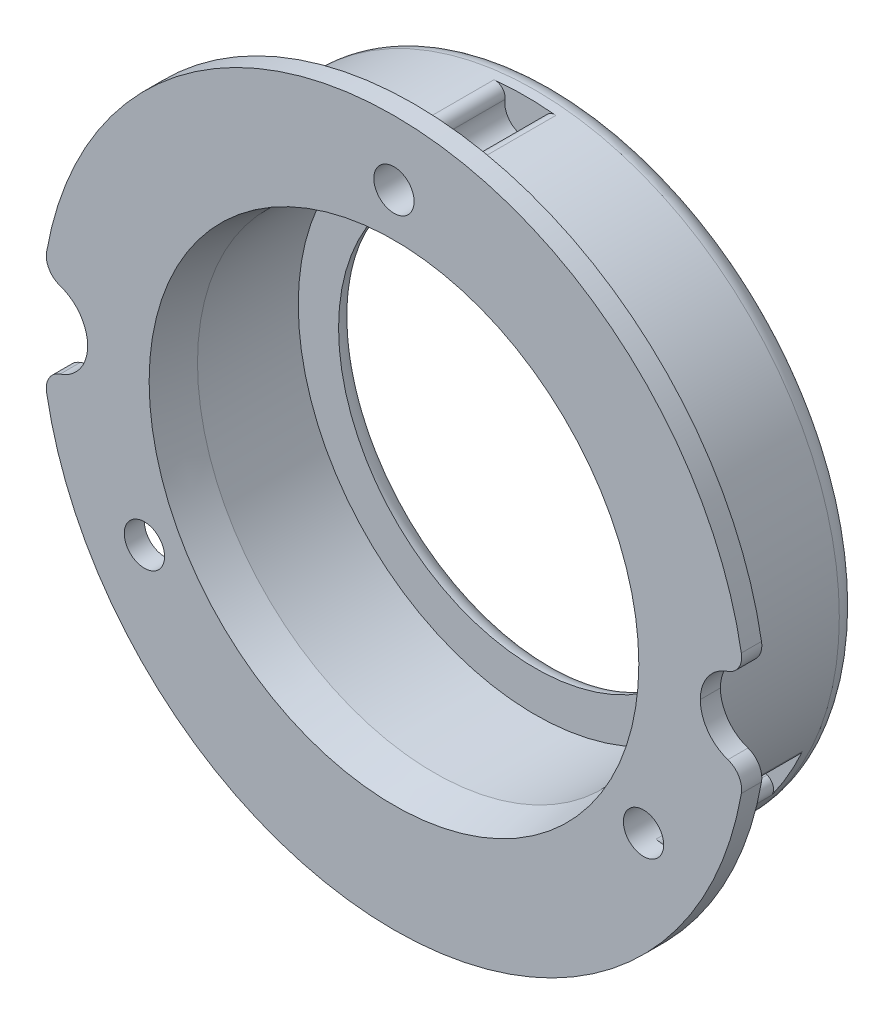
ISO-10303-21;
HEADER;
FILE_DESCRIPTION(('STEP AP214'),'2;1');
FILE_NAME('part.step','',(''),(''),'','','');
FILE_SCHEMA(('AUTOMOTIVE_DESIGN { 1 0 10303 214 1 1 1 1 }'));
ENDSEC;
DATA;
#1=APPLICATION_CONTEXT('core data for automotive mechanical design processes');
#2=APPLICATION_PROTOCOL_DEFINITION('international standard','automotive_design',2000,#1);
#3=PRODUCT_CONTEXT('',#1,'mechanical');
#4=PRODUCT('Part','Part','',(#3));
#5=PRODUCT_RELATED_PRODUCT_CATEGORY('part','',(#4));
#6=PRODUCT_DEFINITION_FORMATION('','',#4);
#7=PRODUCT_DEFINITION_CONTEXT('part definition',#1,'design');
#8=PRODUCT_DEFINITION('design','',#6,#7);
#9=PRODUCT_DEFINITION_SHAPE('','',#8);
#10=(LENGTH_UNIT() NAMED_UNIT(*) SI_UNIT(.MILLI.,.METRE.));
#11=(NAMED_UNIT(*) PLANE_ANGLE_UNIT() SI_UNIT($,.RADIAN.));
#12=(NAMED_UNIT(*) SI_UNIT($,.STERADIAN.) SOLID_ANGLE_UNIT());
#13=UNCERTAINTY_MEASURE_WITH_UNIT(LENGTH_MEASURE(1.E-05),#10,'distance_accuracy_value','');
#14=(GEOMETRIC_REPRESENTATION_CONTEXT(3) GLOBAL_UNCERTAINTY_ASSIGNED_CONTEXT((#13)) GLOBAL_UNIT_ASSIGNED_CONTEXT((#10,
#11,#12)) REPRESENTATION_CONTEXT('',''));
#15=CARTESIAN_POINT('',(0.,0.,0.));
#16=DIRECTION('',(0.,0.,1.));
#17=DIRECTION('',(1.,0.,0.));
#18=AXIS2_PLACEMENT_3D('',#15,#16,#17);
#19=CARTESIAN_POINT('',(0.,0.,4.5));
#20=DIRECTION('',(0.,0.,1.));
#21=DIRECTION('',(1.,0.,0.));
#22=AXIS2_PLACEMENT_3D('',#19,#20,#21);
#23=PLANE('',#22);
#24=CARTESIAN_POINT('',(0.,0.,4.5));
#25=DIRECTION('',(0.,0.,1.));
#26=DIRECTION('',(1.,0.,0.));
#27=AXIS2_PLACEMENT_3D('',#24,#25,#26);
#28=CIRCLE('',#27,12.15);
#29=CARTESIAN_POINT('',(12.15,0.,4.5));
#30=VERTEX_POINT('',#29);
#31=EDGE_CURVE('E11',#30,#30,#28,.F.);
#32=ORIENTED_EDGE('',*,*,#31,.T.);
#33=EDGE_LOOP('',(#32));
#34=FACE_BOUND('',#33,.T.);
#35=CARTESIAN_POINT('',(-12.3841632741175,-7.14999999999988,4.5));
#36=DIRECTION('',(0.,0.,1.));
#37=DIRECTION('',(-0.499999999999992,0.866025403784443,0.));
#38=AXIS2_PLACEMENT_3D('',#35,#36,#37);
#39=CIRCLE('',#38,1.);
#40=CARTESIAN_POINT('',(-12.8841632741175,-6.28397459621544,4.5));
#41=VERTEX_POINT('',#40);
#42=EDGE_CURVE('E473',#41,#41,#39,.T.);
#43=ORIENTED_EDGE('',*,*,#42,.F.);
#44=EDGE_LOOP('',(#43));
#45=FACE_BOUND('',#44,.T.);
#46=CARTESIAN_POINT('',(12.3841632741174,-7.15000000000006,4.5));
#47=DIRECTION('',(0.,0.,1.));
#48=DIRECTION('',(-0.500000000000004,-0.866025403784436,0.));
#49=AXIS2_PLACEMENT_3D('',#46,#47,#48);
#50=CIRCLE('',#49,1.);
#51=CARTESIAN_POINT('',(11.8841632741174,-8.0160254037845,4.5));
#52=VERTEX_POINT('',#51);
#53=EDGE_CURVE('E465',#52,#52,#50,.T.);
#54=ORIENTED_EDGE('',*,*,#53,.F.);
#55=EDGE_LOOP('',(#54));
#56=FACE_BOUND('',#55,.T.);
#57=CARTESIAN_POINT('',(0.,14.3,4.5));
#58=DIRECTION('',(0.,0.,1.));
#59=DIRECTION('',(1.,0.,0.));
#60=AXIS2_PLACEMENT_3D('',#57,#58,#59);
#61=CIRCLE('',#60,1.);
#62=CARTESIAN_POINT('',(1.,14.3,4.5));
#63=VERTEX_POINT('',#62);
#64=EDGE_CURVE('E457',#63,#63,#61,.T.);
#65=ORIENTED_EDGE('',*,*,#64,.F.);
#66=EDGE_LOOP('',(#65));
#67=FACE_BOUND('',#66,.T.);
#68=CARTESIAN_POINT('',(17.2,0.,4.5));
#69=DIRECTION('',(0.,0.,1.));
#70=DIRECTION('',(1.,0.,0.));
#71=AXIS2_PLACEMENT_3D('',#68,#69,#70);
#72=CIRCLE('',#71,2.);
#73=CARTESIAN_POINT('',(15.2,0.,4.5));
#74=VERTEX_POINT('',#73);
#75=CARTESIAN_POINT('',(16.5684108527132,1.89765517126519,4.5));
#76=VERTEX_POINT('',#75);
#77=EDGE_CURVE('E220',#74,#76,#72,.F.);
#78=ORIENTED_EDGE('',*,*,#77,.T.);
#79=CARTESIAN_POINT('',(16.2526162790698,2.84648275689778,4.5));
#80=DIRECTION('',(0.,0.,1.));
#81=DIRECTION('',(1.,0.,0.));
#82=AXIS2_PLACEMENT_3D('',#79,#80,#81);
#83=CIRCLE('',#82,1.);
#84=CARTESIAN_POINT('',(17.2376233262861,3.01899686337644,4.5));
#85=VERTEX_POINT('',#84);
#86=EDGE_CURVE('E243',#76,#85,#83,.T.);
#87=ORIENTED_EDGE('',*,*,#86,.T.);
#88=CARTESIAN_POINT('',(0.,0.,4.5));
#89=DIRECTION('',(0.,0.,1.));
#90=DIRECTION('',(1.,0.,0.));
#91=AXIS2_PLACEMENT_3D('',#88,#89,#90);
#92=CIRCLE('',#91,17.5);
#93=CARTESIAN_POINT('',(-17.2376233262861,3.01899686337643,4.5));
#94=VERTEX_POINT('',#93);
#95=EDGE_CURVE('E449',#85,#94,#92,.T.);
#96=ORIENTED_EDGE('',*,*,#95,.T.);
#97=CARTESIAN_POINT('',(-16.2526162790698,2.84648275689778,4.5));
#98=DIRECTION('',(0.,0.,1.));
#99=DIRECTION('',(1.,0.,0.));
#100=AXIS2_PLACEMENT_3D('',#97,#98,#99);
#101=CIRCLE('',#100,1.);
#102=CARTESIAN_POINT('',(-16.5684108527132,1.89765517126519,4.5));
#103=VERTEX_POINT('',#102);
#104=EDGE_CURVE('E237',#94,#103,#101,.T.);
#105=ORIENTED_EDGE('',*,*,#104,.T.);
#106=CARTESIAN_POINT('',(-17.2,0.,4.5));
#107=DIRECTION('',(0.,0.,1.));
#108=DIRECTION('',(1.,0.,0.));
#109=AXIS2_PLACEMENT_3D('',#106,#107,#108);
#110=CIRCLE('',#109,2.);
#111=CARTESIAN_POINT('',(-15.2,0.,4.5));
#112=VERTEX_POINT('',#111);
#113=EDGE_CURVE('E207',#103,#112,#110,.F.);
#114=ORIENTED_EDGE('',*,*,#113,.T.);
#115=CARTESIAN_POINT('',(-17.2,0.,4.5));
#116=DIRECTION('',(0.,0.,1.));
#117=DIRECTION('',(1.,0.,0.));
#118=AXIS2_PLACEMENT_3D('',#115,#116,#117);
#119=CIRCLE('',#118,2.);
#120=CARTESIAN_POINT('',(-16.5684108527132,-1.89765517126519,4.5));
#121=VERTEX_POINT('',#120);
#122=EDGE_CURVE('E195',#112,#121,#119,.F.);
#123=ORIENTED_EDGE('',*,*,#122,.T.);
#124=CARTESIAN_POINT('',(-16.2526162790698,-2.84648275689778,4.5));
#125=DIRECTION('',(0.,0.,1.));
#126=DIRECTION('',(1.,0.,0.));
#127=AXIS2_PLACEMENT_3D('',#124,#125,#126);
#128=CIRCLE('',#127,1.);
#129=CARTESIAN_POINT('',(-17.2376233262861,-3.01899686337643,4.5));
#130=VERTEX_POINT('',#129);
#131=EDGE_CURVE('E239',#121,#130,#128,.T.);
#132=ORIENTED_EDGE('',*,*,#131,.T.);
#133=CARTESIAN_POINT('',(17.2376233262861,-3.01899686337644,4.5));
#134=VERTEX_POINT('',#133);
#135=EDGE_CURVE('E452',#130,#134,#92,.T.);
#136=ORIENTED_EDGE('',*,*,#135,.T.);
#137=CARTESIAN_POINT('',(16.2526162790698,-2.84648275689778,4.5));
#138=DIRECTION('',(0.,0.,1.));
#139=DIRECTION('',(1.,0.,0.));
#140=AXIS2_PLACEMENT_3D('',#137,#138,#139);
#141=CIRCLE('',#140,1.);
#142=CARTESIAN_POINT('',(16.5684108527132,-1.89765517126519,4.5));
#143=VERTEX_POINT('',#142);
#144=EDGE_CURVE('E241',#134,#143,#141,.T.);
#145=ORIENTED_EDGE('',*,*,#144,.T.);
#146=CARTESIAN_POINT('',(17.2,0.,4.5));
#147=DIRECTION('',(0.,0.,1.));
#148=DIRECTION('',(1.,0.,0.));
#149=AXIS2_PLACEMENT_3D('',#146,#147,#148);
#150=CIRCLE('',#149,2.);
#151=EDGE_CURVE('E708',#143,#74,#150,.F.);
#152=ORIENTED_EDGE('',*,*,#151,.T.);
#153=EDGE_LOOP('',(#78,#87,#96,#105,#114,#123,#132,#136,#145,#152));
#154=FACE_BOUND('',#153,.T.);
#155=ADVANCED_FACE('F37',(#34,#45,#56,#67,#154),#23,.T.);
#156=CARTESIAN_POINT('',(0.,0.,3.5));
#157=DIRECTION('',(0.,0.,1.));
#158=DIRECTION('',(1.,0.,0.));
#159=AXIS2_PLACEMENT_3D('',#156,#157,#158);
#160=PLANE('',#159);
#161=CARTESIAN_POINT('',(0.,14.3,3.5));
#162=DIRECTION('',(0.,0.,1.));
#163=DIRECTION('',(1.,0.,0.));
#164=AXIS2_PLACEMENT_3D('',#161,#162,#163);
#165=CIRCLE('',#164,1.);
#166=CARTESIAN_POINT('',(0.988738981152018,14.4496503496503,3.5));
#167=VERTEX_POINT('',#166);
#168=CARTESIAN_POINT('',(-0.988738981152017,14.4496503496503,3.5));
#169=VERTEX_POINT('',#168);
#170=EDGE_CURVE('E52',#167,#169,#165,.T.);
#171=ORIENTED_EDGE('',*,*,#170,.T.);
#172=CARTESIAN_POINT('',(-1.48310847172803,14.5244755244755,3.5));
#173=DIRECTION('',(0.,0.,1.));
#174=DIRECTION('',(1.,0.,0.));
#175=AXIS2_PLACEMENT_3D('',#172,#173,#174);
#176=CIRCLE('',#175,0.5);
#177=CARTESIAN_POINT('',(-1.53389985774611,15.0218890698343,3.5));
#178=VERTEX_POINT('',#177);
#179=EDGE_CURVE('E315',#169,#178,#176,.T.);
#180=ORIENTED_EDGE('',*,*,#179,.T.);
#181=CARTESIAN_POINT('',(0.,0.,3.5));
#182=DIRECTION('',(0.,0.,1.));
#183=DIRECTION('',(1.,0.,0.));
#184=AXIS2_PLACEMENT_3D('',#181,#182,#183);
#185=CIRCLE('',#184,15.1);
#186=CARTESIAN_POINT('',(-13.7762874761814,-6.18254829124754,3.5));
#187=VERTEX_POINT('',#186);
#188=EDGE_CURVE('E430',#178,#187,#185,.T.);
#189=ORIENTED_EDGE('',*,*,#188,.T.);
#190=CARTESIAN_POINT('',(-13.3201190167052,-5.97782814915325,3.5));
#191=DIRECTION('',(0.,0.,1.));
#192=DIRECTION('',(1.,0.,0.));
#193=AXIS2_PLACEMENT_3D('',#190,#191,#192);
#194=CIRCLE('',#193,0.5);
#195=CARTESIAN_POINT('',(-13.008133769176,-6.36855209943546,3.5));
#196=VERTEX_POINT('',#195);
#197=EDGE_CURVE('E307',#187,#196,#194,.T.);
#198=ORIENTED_EDGE('',*,*,#197,.T.);
#199=CARTESIAN_POINT('',(-12.3841632741175,-7.14999999999988,3.5));
#200=DIRECTION('',(0.,0.,1.));
#201=DIRECTION('',(1.,0.,0.));
#202=AXIS2_PLACEMENT_3D('',#199,#200,#201);
#203=CIRCLE('',#202,1.);
#204=CARTESIAN_POINT('',(-12.019394788024,-8.08109825021465,3.5));
#205=VERTEX_POINT('',#204);
#206=EDGE_CURVE('E468',#196,#205,#203,.T.);
#207=ORIENTED_EDGE('',*,*,#206,.T.);
#208=CARTESIAN_POINT('',(-11.8370105449772,-8.54664737532203,3.5));
#209=DIRECTION('',(0.,0.,1.));
#210=DIRECTION('',(1.,0.,0.));
#211=AXIS2_PLACEMENT_3D('',#208,#209,#210);
#212=CIRCLE('',#211,0.5);
#213=CARTESIAN_POINT('',(-12.2423876184353,-8.83934077858649,3.5));
#214=VERTEX_POINT('',#213);
#215=EDGE_CURVE('E305',#205,#214,#212,.T.);
#216=ORIENTED_EDGE('',*,*,#215,.T.);
#217=CARTESIAN_POINT('',(12.2423876184352,-8.83934077858666,3.5));
#218=VERTEX_POINT('',#217);
#219=EDGE_CURVE('E434',#214,#218,#185,.T.);
#220=ORIENTED_EDGE('',*,*,#219,.T.);
#221=CARTESIAN_POINT('',(11.8370105449771,-8.5466473753222,3.5));
#222=DIRECTION('',(0.,0.,1.));
#223=DIRECTION('',(1.,0.,0.));
#224=AXIS2_PLACEMENT_3D('',#221,#222,#223);
#225=CIRCLE('',#224,0.5);
#226=CARTESIAN_POINT('',(12.0193947880239,-8.08109825021482,3.5));
#227=VERTEX_POINT('',#226);
#228=EDGE_CURVE('E293',#218,#227,#225,.T.);
#229=ORIENTED_EDGE('',*,*,#228,.T.);
#230=CARTESIAN_POINT('',(12.3841632741174,-7.15000000000006,3.5));
#231=DIRECTION('',(0.,0.,1.));
#232=DIRECTION('',(1.,0.,0.));
#233=AXIS2_PLACEMENT_3D('',#230,#231,#232);
#234=CIRCLE('',#233,1.);
#235=CARTESIAN_POINT('',(13.0081337691759,-6.36855209943564,3.5));
#236=VERTEX_POINT('',#235);
#237=EDGE_CURVE('E460',#227,#236,#234,.T.);
#238=ORIENTED_EDGE('',*,*,#237,.T.);
#239=CARTESIAN_POINT('',(13.3201190167051,-5.97782814915344,3.5));
#240=DIRECTION('',(0.,0.,1.));
#241=DIRECTION('',(1.,0.,0.));
#242=AXIS2_PLACEMENT_3D('',#239,#240,#241);
#243=CIRCLE('',#242,0.5);
#244=CARTESIAN_POINT('',(13.7762874761813,-6.18254829124773,3.5));
#245=VERTEX_POINT('',#244);
#246=EDGE_CURVE('E301',#236,#245,#243,.T.);
#247=ORIENTED_EDGE('',*,*,#246,.T.);
#248=CARTESIAN_POINT('',(1.53389985774611,15.0218890698343,3.5));
#249=VERTEX_POINT('',#248);
#250=EDGE_CURVE('E436',#245,#249,#185,.T.);
#251=ORIENTED_EDGE('',*,*,#250,.T.);
#252=CARTESIAN_POINT('',(1.48310847172803,14.5244755244755,3.5));
#253=DIRECTION('',(0.,0.,1.));
#254=DIRECTION('',(1.,0.,0.));
#255=AXIS2_PLACEMENT_3D('',#252,#253,#254);
#256=CIRCLE('',#255,0.5);
#257=EDGE_CURVE('E317',#249,#167,#256,.T.);
#258=ORIENTED_EDGE('',*,*,#257,.T.);
#259=EDGE_LOOP('',(#171,#180,#189,#198,#207,#216,#220,#229,#238,#247,#251,#258));
#260=FACE_BOUND('',#259,.T.);
#261=CARTESIAN_POINT('',(0.,0.,3.5));
#262=DIRECTION('',(0.,0.,1.));
#263=DIRECTION('',(1.,0.,0.));
#264=AXIS2_PLACEMENT_3D('',#261,#262,#263);
#265=CIRCLE('',#264,17.5);
#266=CARTESIAN_POINT('',(17.2376233262861,3.01899686337644,3.5));
#267=VERTEX_POINT('',#266);
#268=CARTESIAN_POINT('',(-17.2376233262861,3.01899686337643,3.5));
#269=VERTEX_POINT('',#268);
#270=EDGE_CURVE('E215',#267,#269,#265,.T.);
#271=ORIENTED_EDGE('',*,*,#270,.F.);
#272=CARTESIAN_POINT('',(16.2526162790698,2.84648275689778,3.5));
#273=DIRECTION('',(0.,0.,1.));
#274=DIRECTION('',(1.,0.,0.));
#275=AXIS2_PLACEMENT_3D('',#272,#273,#274);
#276=CIRCLE('',#275,1.);
#277=CARTESIAN_POINT('',(16.5684108527132,1.89765517126519,3.5));
#278=VERTEX_POINT('',#277);
#279=EDGE_CURVE('E233',#267,#278,#276,.F.);
#280=ORIENTED_EDGE('',*,*,#279,.T.);
#281=CARTESIAN_POINT('',(17.2,0.,3.5));
#282=DIRECTION('',(0.,0.,1.));
#283=DIRECTION('',(1.,0.,0.));
#284=AXIS2_PLACEMENT_3D('',#281,#282,#283);
#285=CIRCLE('',#284,2.);
#286=CARTESIAN_POINT('',(15.2,0.,3.5));
#287=VERTEX_POINT('',#286);
#288=EDGE_CURVE('E703',#278,#287,#285,.T.);
#289=ORIENTED_EDGE('',*,*,#288,.T.);
#290=CARTESIAN_POINT('',(17.2,0.,3.5));
#291=DIRECTION('',(0.,0.,1.));
#292=DIRECTION('',(1.,0.,0.));
#293=AXIS2_PLACEMENT_3D('',#290,#291,#292);
#294=CIRCLE('',#293,2.);
#295=CARTESIAN_POINT('',(16.5684108527132,-1.89765517126519,3.5));
#296=VERTEX_POINT('',#295);
#297=EDGE_CURVE('E709',#287,#296,#294,.T.);
#298=ORIENTED_EDGE('',*,*,#297,.T.);
#299=CARTESIAN_POINT('',(16.2526162790698,-2.84648275689778,3.5));
#300=DIRECTION('',(0.,0.,1.));
#301=DIRECTION('',(1.,0.,0.));
#302=AXIS2_PLACEMENT_3D('',#299,#300,#301);
#303=CIRCLE('',#302,1.);
#304=CARTESIAN_POINT('',(17.2376233262861,-3.01899686337644,3.5));
#305=VERTEX_POINT('',#304);
#306=EDGE_CURVE('E231',#296,#305,#303,.F.);
#307=ORIENTED_EDGE('',*,*,#306,.T.);
#308=CARTESIAN_POINT('',(-17.2376233262861,-3.01899686337643,3.5));
#309=VERTEX_POINT('',#308);
#310=EDGE_CURVE('E211',#309,#305,#265,.T.);
#311=ORIENTED_EDGE('',*,*,#310,.F.);
#312=CARTESIAN_POINT('',(-16.2526162790698,-2.84648275689778,3.5));
#313=DIRECTION('',(0.,0.,1.));
#314=DIRECTION('',(1.,0.,0.));
#315=AXIS2_PLACEMENT_3D('',#312,#313,#314);
#316=CIRCLE('',#315,1.);
#317=CARTESIAN_POINT('',(-16.5684108527132,-1.89765517126519,3.5));
#318=VERTEX_POINT('',#317);
#319=EDGE_CURVE('E190',#309,#318,#316,.F.);
#320=ORIENTED_EDGE('',*,*,#319,.T.);
#321=CARTESIAN_POINT('',(-17.2,0.,3.5));
#322=DIRECTION('',(0.,0.,1.));
#323=DIRECTION('',(1.,0.,0.));
#324=AXIS2_PLACEMENT_3D('',#321,#322,#323);
#325=CIRCLE('',#324,2.);
#326=CARTESIAN_POINT('',(-15.2,0.,3.5));
#327=VERTEX_POINT('',#326);
#328=EDGE_CURVE('E183',#318,#327,#325,.T.);
#329=ORIENTED_EDGE('',*,*,#328,.T.);
#330=CARTESIAN_POINT('',(-17.2,0.,3.5));
#331=DIRECTION('',(0.,0.,1.));
#332=DIRECTION('',(1.,0.,0.));
#333=AXIS2_PLACEMENT_3D('',#330,#331,#332);
#334=CIRCLE('',#333,2.);
#335=CARTESIAN_POINT('',(-16.5684108527132,1.89765517126519,3.5));
#336=VERTEX_POINT('',#335);
#337=EDGE_CURVE('E187',#327,#336,#334,.T.);
#338=ORIENTED_EDGE('',*,*,#337,.T.);
#339=CARTESIAN_POINT('',(-16.2526162790698,2.84648275689778,3.5));
#340=DIRECTION('',(0.,0.,1.));
#341=DIRECTION('',(1.,0.,0.));
#342=AXIS2_PLACEMENT_3D('',#339,#340,#341);
#343=CIRCLE('',#342,1.);
#344=EDGE_CURVE('E228',#336,#269,#343,.F.);
#345=ORIENTED_EDGE('',*,*,#344,.T.);
#346=EDGE_LOOP('',(#271,#280,#289,#298,#307,#311,#320,#329,#338,#345));
#347=FACE_BOUND('',#346,.T.);
#348=ADVANCED_FACE('F186',(#260,#347),#160,.F.);
#349=CARTESIAN_POINT('',(0.,0.,4.5));
#350=DIRECTION('',(0.,0.,-1.));
#351=DIRECTION('',(-1.,0.,0.));
#352=AXIS2_PLACEMENT_3D('',#349,#350,#351);
#353=CYLINDRICAL_SURFACE('',#352,17.5);
#354=ORIENTED_EDGE('',*,*,#310,.T.);
#355=DIRECTION('',(0.,0.,-1.));
#356=VECTOR('',#355,1.);
#357=CARTESIAN_POINT('',(17.2376233262861,-3.01899686337644,4.5));
#358=LINE('',#357,#356);
#359=EDGE_CURVE('E247',#305,#134,#358,.F.);
#360=ORIENTED_EDGE('',*,*,#359,.T.);
#361=ORIENTED_EDGE('',*,*,#135,.F.);
#362=DIRECTION('',(0.,0.,-1.));
#363=VECTOR('',#362,1.);
#364=CARTESIAN_POINT('',(-17.2376233262861,-3.01899686337644,4.5));
#365=LINE('',#364,#363);
#366=EDGE_CURVE('E245',#130,#309,#365,.T.);
#367=ORIENTED_EDGE('',*,*,#366,.T.);
#368=EDGE_LOOP('',(#354,#360,#361,#367));
#369=FACE_BOUND('',#368,.T.);
#370=ADVANCED_FACE('F342',(#369),#353,.T.);
#371=ORIENTED_EDGE('',*,*,#95,.F.);
#372=DIRECTION('',(0.,0.,-1.));
#373=VECTOR('',#372,1.);
#374=CARTESIAN_POINT('',(17.2376233262861,3.01899686337644,4.5));
#375=LINE('',#374,#373);
#376=EDGE_CURVE('E225',#85,#267,#375,.T.);
#377=ORIENTED_EDGE('',*,*,#376,.T.);
#378=ORIENTED_EDGE('',*,*,#270,.T.);
#379=DIRECTION('',(0.,0.,-1.));
#380=VECTOR('',#379,1.);
#381=CARTESIAN_POINT('',(-17.2376233262861,3.01899686337644,4.5));
#382=LINE('',#381,#380);
#383=EDGE_CURVE('E223',#269,#94,#382,.F.);
#384=ORIENTED_EDGE('',*,*,#383,.T.);
#385=EDGE_LOOP('',(#371,#377,#378,#384));
#386=FACE_BOUND('',#385,.T.);
#387=ADVANCED_FACE('F351',(#386),#353,.T.);
#388=CARTESIAN_POINT('',(0.,0.,3.5));
#389=DIRECTION('',(0.,0.,-1.));
#390=DIRECTION('',(-1.,0.,0.));
#391=AXIS2_PLACEMENT_3D('',#388,#389,#390);
#392=CYLINDRICAL_SURFACE('',#391,11.75);
#393=CARTESIAN_POINT('',(0.,0.,2.50000000000001));
#394=DIRECTION('',(0.,0.,1.));
#395=DIRECTION('',(1.,0.,0.));
#396=AXIS2_PLACEMENT_3D('',#393,#394,#395);
#397=CIRCLE('',#396,11.75);
#398=CARTESIAN_POINT('',(11.75,0.,2.50000000000001));
#399=VERTEX_POINT('',#398);
#400=EDGE_CURVE('E45',#399,#399,#397,.T.);
#401=ORIENTED_EDGE('',*,*,#400,.T.);
#402=EDGE_LOOP('',(#401));
#403=FACE_BOUND('',#402,.T.);
#404=CARTESIAN_POINT('',(0.,0.,-2.5));
#405=DIRECTION('',(0.,0.,-1.));
#406=DIRECTION('',(-1.,0.,0.));
#407=AXIS2_PLACEMENT_3D('',#404,#405,#406);
#408=CIRCLE('',#407,11.75);
#409=CARTESIAN_POINT('',(-11.75,0.,-2.5));
#410=VERTEX_POINT('',#409);
#411=EDGE_CURVE('E443',#410,#410,#408,.T.);
#412=ORIENTED_EDGE('',*,*,#411,.T.);
#413=EDGE_LOOP('',(#412));
#414=FACE_BOUND('',#413,.T.);
#415=ADVANCED_FACE('F324',(#403,#414),#392,.F.);
#416=CARTESIAN_POINT('',(0.,0.,-3.5));
#417=DIRECTION('',(0.,0.,1.));
#418=DIRECTION('',(1.,0.,0.));
#419=AXIS2_PLACEMENT_3D('',#416,#417,#418);
#420=PLANE('',#419);
#421=CARTESIAN_POINT('',(0.,0.,-3.5));
#422=DIRECTION('',(0.,0.,1.));
#423=DIRECTION('',(1.,0.,0.));
#424=AXIS2_PLACEMENT_3D('',#421,#422,#423);
#425=CIRCLE('',#424,10.75);
#426=CARTESIAN_POINT('',(10.75,0.,-3.5));
#427=VERTEX_POINT('',#426);
#428=EDGE_CURVE('E196',#427,#427,#425,.T.);
#429=ORIENTED_EDGE('',*,*,#428,.T.);
#430=EDGE_LOOP('',(#429));
#431=FACE_BOUND('',#430,.T.);
#432=CARTESIAN_POINT('',(0.,0.,-3.5));
#433=DIRECTION('',(0.,0.,1.));
#434=DIRECTION('',(1.,0.,0.));
#435=AXIS2_PLACEMENT_3D('',#432,#433,#434);
#436=CIRCLE('',#435,14.1);
#437=CARTESIAN_POINT('',(14.1,0.,-3.5));
#438=VERTEX_POINT('',#437);
#439=EDGE_CURVE('E438',#438,#438,#436,.F.);
#440=ORIENTED_EDGE('',*,*,#439,.T.);
#441=EDGE_LOOP('',(#440));
#442=FACE_BOUND('',#441,.T.);
#443=ADVANCED_FACE('F361',(#431,#442),#420,.F.);
#444=CARTESIAN_POINT('',(0.,0.,3.5));
#445=DIRECTION('',(0.,0.,-1.));
#446=DIRECTION('',(-1.,0.,0.));
#447=AXIS2_PLACEMENT_3D('',#444,#445,#446);
#448=CYLINDRICAL_SURFACE('',#447,15.1);
#449=CARTESIAN_POINT('',(0.,0.,-2.5));
#450=DIRECTION('',(0.,0.,1.));
#451=DIRECTION('',(1.,0.,0.));
#452=AXIS2_PLACEMENT_3D('',#449,#450,#451);
#453=CIRCLE('',#452,15.1);
#454=CARTESIAN_POINT('',(15.1,0.,-2.5));
#455=VERTEX_POINT('',#454);
#456=EDGE_CURVE('E433',#455,#455,#453,.T.);
#457=ORIENTED_EDGE('',*,*,#456,.T.);
#458=EDGE_LOOP('',(#457));
#459=FACE_BOUND('',#458,.T.);
#460=CARTESIAN_POINT('',(0.,0.,-2.));
#461=DIRECTION('',(0.,0.,1.));
#462=DIRECTION('',(1.,0.,0.));
#463=AXIS2_PLACEMENT_3D('',#460,#461,#462);
#464=CIRCLE('',#463,15.1);
#465=CARTESIAN_POINT('',(12.2423876184352,-8.83934077858666,-2.));
#466=VERTEX_POINT('',#465);
#467=CARTESIAN_POINT('',(13.7762874761813,-6.18254829124773,-2.));
#468=VERTEX_POINT('',#467);
#469=EDGE_CURVE('E257',#466,#468,#464,.T.);
#470=ORIENTED_EDGE('',*,*,#469,.F.);
#471=DIRECTION('',(0.,0.,-1.));
#472=VECTOR('',#471,1.);
#473=CARTESIAN_POINT('',(12.2423876184352,-8.83934077858666,3.5));
#474=LINE('',#473,#472);
#475=EDGE_CURVE('E276',#466,#218,#474,.F.);
#476=ORIENTED_EDGE('',*,*,#475,.T.);
#477=ORIENTED_EDGE('',*,*,#219,.F.);
#478=DIRECTION('',(0.,0.,-1.));
#479=VECTOR('',#478,1.);
#480=CARTESIAN_POINT('',(-12.2423876184353,-8.83934077858649,3.5));
#481=LINE('',#480,#479);
#482=CARTESIAN_POINT('',(-12.2423876184353,-8.83934077858649,-2.));
#483=VERTEX_POINT('',#482);
#484=EDGE_CURVE('E270',#214,#483,#481,.T.);
#485=ORIENTED_EDGE('',*,*,#484,.T.);
#486=CARTESIAN_POINT('',(0.,0.,-2.));
#487=DIRECTION('',(0.,0.,1.));
#488=DIRECTION('',(1.,0.,0.));
#489=AXIS2_PLACEMENT_3D('',#486,#487,#488);
#490=CIRCLE('',#489,15.1);
#491=CARTESIAN_POINT('',(-13.7762874761814,-6.18254829124754,-2.));
#492=VERTEX_POINT('',#491);
#493=EDGE_CURVE('E259',#492,#483,#490,.T.);
#494=ORIENTED_EDGE('',*,*,#493,.F.);
#495=DIRECTION('',(0.,0.,-1.));
#496=VECTOR('',#495,1.);
#497=CARTESIAN_POINT('',(-13.7762874761814,-6.18254829124754,3.5));
#498=LINE('',#497,#496);
#499=EDGE_CURVE('E267',#492,#187,#498,.F.);
#500=ORIENTED_EDGE('',*,*,#499,.T.);
#501=ORIENTED_EDGE('',*,*,#188,.F.);
#502=DIRECTION('',(0.,0.,-1.));
#503=VECTOR('',#502,1.);
#504=CARTESIAN_POINT('',(-1.53389985774611,15.0218890698343,3.5));
#505=LINE('',#504,#503);
#506=CARTESIAN_POINT('',(-1.53389985774611,15.0218890698343,-2.));
#507=VERTEX_POINT('',#506);
#508=EDGE_CURVE('E264',#178,#507,#505,.T.);
#509=ORIENTED_EDGE('',*,*,#508,.T.);
#510=CARTESIAN_POINT('',(0.,0.,-2.));
#511=DIRECTION('',(0.,0.,1.));
#512=DIRECTION('',(1.,0.,0.));
#513=AXIS2_PLACEMENT_3D('',#510,#511,#512);
#514=CIRCLE('',#513,15.1);
#515=CARTESIAN_POINT('',(1.53389985774611,15.0218890698343,-2.));
#516=VERTEX_POINT('',#515);
#517=EDGE_CURVE('E255',#516,#507,#514,.T.);
#518=ORIENTED_EDGE('',*,*,#517,.F.);
#519=DIRECTION('',(0.,0.,-1.));
#520=VECTOR('',#519,1.);
#521=CARTESIAN_POINT('',(1.53389985774611,15.0218890698343,3.5));
#522=LINE('',#521,#520);
#523=EDGE_CURVE('E261',#516,#249,#522,.F.);
#524=ORIENTED_EDGE('',*,*,#523,.T.);
#525=ORIENTED_EDGE('',*,*,#250,.F.);
#526=DIRECTION('',(0.,0.,-1.));
#527=VECTOR('',#526,1.);
#528=CARTESIAN_POINT('',(13.7762874761813,-6.18254829124773,3.5));
#529=LINE('',#528,#527);
#530=EDGE_CURVE('E273',#245,#468,#529,.T.);
#531=ORIENTED_EDGE('',*,*,#530,.T.);
#532=EDGE_LOOP('',(#470,#476,#477,#485,#494,#500,#501,#509,#518,#524,#525,#531));
#533=FACE_BOUND('',#532,.T.);
#534=ADVANCED_FACE('F357',(#459,#533),#448,.T.);
#535=CARTESIAN_POINT('',(0.,0.,-2.5));
#536=DIRECTION('',(0.,0.,-1.));
#537=DIRECTION('',(-1.,0.,0.));
#538=AXIS2_PLACEMENT_3D('',#535,#536,#537);
#539=PLANE('',#538);
#540=CARTESIAN_POINT('',(0.,0.,-2.5));
#541=DIRECTION('',(0.,0.,-1.));
#542=DIRECTION('',(-1.,0.,0.));
#543=AXIS2_PLACEMENT_3D('',#540,#541,#542);
#544=CIRCLE('',#543,9.75);
#545=CARTESIAN_POINT('',(-9.75,0.,-2.5));
#546=VERTEX_POINT('',#545);
#547=EDGE_CURVE('E446',#546,#546,#544,.T.);
#548=ORIENTED_EDGE('',*,*,#547,.T.);
#549=EDGE_LOOP('',(#548));
#550=FACE_BOUND('',#549,.T.);
#551=ORIENTED_EDGE('',*,*,#411,.F.);
#552=EDGE_LOOP('',(#551));
#553=FACE_BOUND('',#552,.T.);
#554=ADVANCED_FACE('F353',(#550,#553),#539,.F.);
#555=CARTESIAN_POINT('',(0.,0.,-2.5));
#556=DIRECTION('',(0.,0.,1.));
#557=DIRECTION('',(1.,0.,0.));
#558=AXIS2_PLACEMENT_3D('',#555,#556,#557);
#559=TOROIDAL_SURFACE('',#558,14.1,1.);
#560=ORIENTED_EDGE('',*,*,#439,.F.);
#561=EDGE_LOOP('',(#560));
#562=FACE_BOUND('',#561,.T.);
#563=ORIENTED_EDGE('',*,*,#456,.F.);
#564=EDGE_LOOP('',(#563));
#565=FACE_BOUND('',#564,.T.);
#566=ADVANCED_FACE('F356',(#562,#565),#559,.T.);
#567=CARTESIAN_POINT('',(0.,0.,-2.5));
#568=DIRECTION('',(0.,0.,1.));
#569=DIRECTION('',(1.,0.,0.));
#570=AXIS2_PLACEMENT_3D('',#567,#568,#569);
#571=TOROIDAL_SURFACE('',#570,10.75,1.);
#572=ORIENTED_EDGE('',*,*,#428,.F.);
#573=EDGE_LOOP('',(#572));
#574=FACE_BOUND('',#573,.T.);
#575=ORIENTED_EDGE('',*,*,#547,.F.);
#576=EDGE_LOOP('',(#575));
#577=FACE_BOUND('',#576,.T.);
#578=ADVANCED_FACE('F370',(#574,#577),#571,.T.);
#579=CARTESIAN_POINT('',(-17.2,0.,4.5));
#580=DIRECTION('',(0.,0.,-1.));
#581=DIRECTION('',(-1.,0.,0.));
#582=AXIS2_PLACEMENT_3D('',#579,#580,#581);
#583=CYLINDRICAL_SURFACE('',#582,2.);
#584=ORIENTED_EDGE('',*,*,#113,.F.);
#585=DIRECTION('',(0.,0.,-1.));
#586=VECTOR('',#585,1.);
#587=CARTESIAN_POINT('',(-16.5684108527132,1.89765517126519,4.5));
#588=LINE('',#587,#586);
#589=EDGE_CURVE('E206',#103,#336,#588,.T.);
#590=ORIENTED_EDGE('',*,*,#589,.T.);
#591=ORIENTED_EDGE('',*,*,#337,.F.);
#592=DIRECTION('',(0.,0.,-1.));
#593=VECTOR('',#592,1.);
#594=CARTESIAN_POINT('',(-15.2,0.,4.5));
#595=LINE('',#594,#593);
#596=EDGE_CURVE('E203',#112,#327,#595,.T.);
#597=ORIENTED_EDGE('',*,*,#596,.F.);
#598=EDGE_LOOP('',(#584,#590,#591,#597));
#599=FACE_BOUND('',#598,.T.);
#600=ADVANCED_FACE('F202',(#599),#583,.F.);
#601=CARTESIAN_POINT('',(-17.2,0.,4.5));
#602=DIRECTION('',(0.,0.,-1.));
#603=DIRECTION('',(-1.,0.,0.));
#604=AXIS2_PLACEMENT_3D('',#601,#602,#603);
#605=CYLINDRICAL_SURFACE('',#604,2.);
#606=ORIENTED_EDGE('',*,*,#328,.F.);
#607=DIRECTION('',(0.,0.,-1.));
#608=VECTOR('',#607,1.);
#609=CARTESIAN_POINT('',(-16.5684108527132,-1.89765517126519,4.5));
#610=LINE('',#609,#608);
#611=EDGE_CURVE('E252',#318,#121,#610,.F.);
#612=ORIENTED_EDGE('',*,*,#611,.T.);
#613=ORIENTED_EDGE('',*,*,#122,.F.);
#614=ORIENTED_EDGE('',*,*,#596,.T.);
#615=EDGE_LOOP('',(#606,#612,#613,#614));
#616=FACE_BOUND('',#615,.T.);
#617=ADVANCED_FACE('F209',(#616),#605,.F.);
#618=CARTESIAN_POINT('',(17.2,0.,4.5));
#619=DIRECTION('',(0.,0.,-1.));
#620=DIRECTION('',(-1.,0.,0.));
#621=AXIS2_PLACEMENT_3D('',#618,#619,#620);
#622=CYLINDRICAL_SURFACE('',#621,2.);
#623=ORIENTED_EDGE('',*,*,#288,.F.);
#624=DIRECTION('',(0.,0.,-1.));
#625=VECTOR('',#624,1.);
#626=CARTESIAN_POINT('',(16.5684108527132,1.89765517126519,4.5));
#627=LINE('',#626,#625);
#628=EDGE_CURVE('E235',#278,#76,#627,.F.);
#629=ORIENTED_EDGE('',*,*,#628,.T.);
#630=ORIENTED_EDGE('',*,*,#77,.F.);
#631=DIRECTION('',(0.,0.,-1.));
#632=VECTOR('',#631,1.);
#633=CARTESIAN_POINT('',(15.2,0.,4.5));
#634=LINE('',#633,#632);
#635=EDGE_CURVE('E212',#287,#74,#634,.F.);
#636=ORIENTED_EDGE('',*,*,#635,.F.);
#637=EDGE_LOOP('',(#623,#629,#630,#636));
#638=FACE_BOUND('',#637,.T.);
#639=ADVANCED_FACE('F377',(#638),#622,.F.);
#640=CARTESIAN_POINT('',(17.2,0.,4.5));
#641=DIRECTION('',(0.,0.,-1.));
#642=DIRECTION('',(-1.,0.,0.));
#643=AXIS2_PLACEMENT_3D('',#640,#641,#642);
#644=CYLINDRICAL_SURFACE('',#643,2.);
#645=ORIENTED_EDGE('',*,*,#151,.F.);
#646=DIRECTION('',(0.,0.,-1.));
#647=VECTOR('',#646,1.);
#648=CARTESIAN_POINT('',(16.5684108527132,-1.89765517126519,4.5));
#649=LINE('',#648,#647);
#650=EDGE_CURVE('E250',#143,#296,#649,.T.);
#651=ORIENTED_EDGE('',*,*,#650,.T.);
#652=ORIENTED_EDGE('',*,*,#297,.F.);
#653=ORIENTED_EDGE('',*,*,#635,.T.);
#654=EDGE_LOOP('',(#645,#651,#652,#653));
#655=FACE_BOUND('',#654,.T.);
#656=ADVANCED_FACE('F380',(#655),#644,.F.);
#657=CARTESIAN_POINT('',(16.2526162790698,2.84648275689778,4.5));
#658=DIRECTION('',(0.,0.,1.));
#659=DIRECTION('',(1.,0.,0.));
#660=AXIS2_PLACEMENT_3D('',#657,#658,#659);
#661=CYLINDRICAL_SURFACE('',#660,1.);
#662=ORIENTED_EDGE('',*,*,#86,.F.);
#663=ORIENTED_EDGE('',*,*,#628,.F.);
#664=ORIENTED_EDGE('',*,*,#279,.F.);
#665=ORIENTED_EDGE('',*,*,#376,.F.);
#666=EDGE_LOOP('',(#662,#663,#664,#665));
#667=FACE_BOUND('',#666,.T.);
#668=ADVANCED_FACE('F383',(#667),#661,.T.);
#669=CARTESIAN_POINT('',(16.2526162790698,-2.84648275689778,4.5));
#670=DIRECTION('',(0.,0.,-1.));
#671=DIRECTION('',(-1.,0.,0.));
#672=AXIS2_PLACEMENT_3D('',#669,#670,#671);
#673=CYLINDRICAL_SURFACE('',#672,1.);
#674=ORIENTED_EDGE('',*,*,#306,.F.);
#675=ORIENTED_EDGE('',*,*,#650,.F.);
#676=ORIENTED_EDGE('',*,*,#144,.F.);
#677=ORIENTED_EDGE('',*,*,#359,.F.);
#678=EDGE_LOOP('',(#674,#675,#676,#677));
#679=FACE_BOUND('',#678,.T.);
#680=ADVANCED_FACE('F390',(#679),#673,.T.);
#681=CARTESIAN_POINT('',(-16.2526162790698,-2.84648275689778,4.5));
#682=DIRECTION('',(0.,0.,-1.));
#683=DIRECTION('',(-1.,0.,0.));
#684=AXIS2_PLACEMENT_3D('',#681,#682,#683);
#685=CYLINDRICAL_SURFACE('',#684,1.);
#686=ORIENTED_EDGE('',*,*,#319,.F.);
#687=ORIENTED_EDGE('',*,*,#366,.F.);
#688=ORIENTED_EDGE('',*,*,#131,.F.);
#689=ORIENTED_EDGE('',*,*,#611,.F.);
#690=EDGE_LOOP('',(#686,#687,#688,#689));
#691=FACE_BOUND('',#690,.T.);
#692=ADVANCED_FACE('F394',(#691),#685,.T.);
#693=CARTESIAN_POINT('',(-16.2526162790698,2.84648275689778,4.5));
#694=DIRECTION('',(0.,0.,1.));
#695=DIRECTION('',(1.,0.,0.));
#696=AXIS2_PLACEMENT_3D('',#693,#694,#695);
#697=CYLINDRICAL_SURFACE('',#696,1.);
#698=ORIENTED_EDGE('',*,*,#104,.F.);
#699=ORIENTED_EDGE('',*,*,#383,.F.);
#700=ORIENTED_EDGE('',*,*,#344,.F.);
#701=ORIENTED_EDGE('',*,*,#589,.F.);
#702=EDGE_LOOP('',(#698,#699,#700,#701));
#703=FACE_BOUND('',#702,.T.);
#704=ADVANCED_FACE('F398',(#703),#697,.T.);
#705=CARTESIAN_POINT('',(0.,14.3,-2.));
#706=DIRECTION('',(0.,0.,1.));
#707=DIRECTION('',(1.,0.,0.));
#708=AXIS2_PLACEMENT_3D('',#705,#706,#707);
#709=CYLINDRICAL_SURFACE('',#708,1.);
#710=ORIENTED_EDGE('',*,*,#64,.T.);
#711=EDGE_LOOP('',(#710));
#712=FACE_BOUND('',#711,.T.);
#713=CARTESIAN_POINT('',(0.,14.3,-2.));
#714=DIRECTION('',(0.,0.,1.));
#715=DIRECTION('',(1.,0.,0.));
#716=AXIS2_PLACEMENT_3D('',#713,#714,#715);
#717=CIRCLE('',#716,1.);
#718=CARTESIAN_POINT('',(-0.988738981152017,14.4496503496503,-2.));
#719=VERTEX_POINT('',#718);
#720=CARTESIAN_POINT('',(0.988738981152018,14.4496503496503,-2.));
#721=VERTEX_POINT('',#720);
#722=EDGE_CURVE('E456',#719,#721,#717,.T.);
#723=ORIENTED_EDGE('',*,*,#722,.F.);
#724=DIRECTION('',(0.,0.,1.));
#725=VECTOR('',#724,1.);
#726=CARTESIAN_POINT('',(-0.988738981152017,14.4496503496503,-2.));
#727=LINE('',#726,#725);
#728=EDGE_CURVE('E291',#719,#169,#727,.T.);
#729=ORIENTED_EDGE('',*,*,#728,.T.);
#730=ORIENTED_EDGE('',*,*,#170,.F.);
#731=DIRECTION('',(0.,0.,1.));
#732=VECTOR('',#731,1.);
#733=CARTESIAN_POINT('',(0.988738981152018,14.4496503496503,-2.));
#734=LINE('',#733,#732);
#735=EDGE_CURVE('E289',#167,#721,#734,.F.);
#736=ORIENTED_EDGE('',*,*,#735,.T.);
#737=EDGE_LOOP('',(#723,#729,#730,#736));
#738=FACE_BOUND('',#737,.T.);
#739=ADVANCED_FACE('F346',(#712,#738),#709,.F.);
#740=CARTESIAN_POINT('',(0.,14.3,-2.));
#741=DIRECTION('',(0.,0.,1.));
#742=DIRECTION('',(1.,0.,0.));
#743=AXIS2_PLACEMENT_3D('',#740,#741,#742);
#744=PLANE('',#743);
#745=ORIENTED_EDGE('',*,*,#517,.T.);
#746=CARTESIAN_POINT('',(-1.48310847172803,14.5244755244755,-2.));
#747=DIRECTION('',(0.,0.,1.));
#748=DIRECTION('',(1.,0.,0.));
#749=AXIS2_PLACEMENT_3D('',#746,#747,#748);
#750=CIRCLE('',#749,0.5);
#751=EDGE_CURVE('E313',#507,#719,#750,.F.);
#752=ORIENTED_EDGE('',*,*,#751,.T.);
#753=ORIENTED_EDGE('',*,*,#722,.T.);
#754=CARTESIAN_POINT('',(1.48310847172803,14.5244755244755,-2.));
#755=DIRECTION('',(0.,0.,1.));
#756=DIRECTION('',(1.,0.,0.));
#757=AXIS2_PLACEMENT_3D('',#754,#755,#756);
#758=CIRCLE('',#757,0.5);
#759=EDGE_CURVE('E319',#721,#516,#758,.F.);
#760=ORIENTED_EDGE('',*,*,#759,.T.);
#761=EDGE_LOOP('',(#745,#752,#753,#760));
#762=FACE_BOUND('',#761,.T.);
#763=ADVANCED_FACE('F505',(#762),#744,.T.);
#764=CARTESIAN_POINT('',(12.3841632741174,-7.15000000000006,-2.));
#765=DIRECTION('',(0.,0.,1.));
#766=DIRECTION('',(1.,0.,0.));
#767=AXIS2_PLACEMENT_3D('',#764,#765,#766);
#768=CYLINDRICAL_SURFACE('',#767,1.);
#769=ORIENTED_EDGE('',*,*,#53,.T.);
#770=EDGE_LOOP('',(#769));
#771=FACE_BOUND('',#770,.T.);
#772=ORIENTED_EDGE('',*,*,#237,.F.);
#773=DIRECTION('',(0.,0.,1.));
#774=VECTOR('',#773,1.);
#775=CARTESIAN_POINT('',(12.0193947880239,-8.08109825021482,-2.));
#776=LINE('',#775,#774);
#777=CARTESIAN_POINT('',(12.0193947880239,-8.08109825021482,-2.));
#778=VERTEX_POINT('',#777);
#779=EDGE_CURVE('E282',#227,#778,#776,.F.);
#780=ORIENTED_EDGE('',*,*,#779,.T.);
#781=CARTESIAN_POINT('',(12.3841632741174,-7.15000000000006,-2.));
#782=DIRECTION('',(0.,0.,1.));
#783=DIRECTION('',(-0.500000000000004,-0.866025403784436,0.));
#784=AXIS2_PLACEMENT_3D('',#781,#782,#783);
#785=CIRCLE('',#784,1.);
#786=CARTESIAN_POINT('',(13.0081337691759,-6.36855209943564,-2.));
#787=VERTEX_POINT('',#786);
#788=EDGE_CURVE('E464',#787,#778,#785,.T.);
#789=ORIENTED_EDGE('',*,*,#788,.F.);
#790=DIRECTION('',(0.,0.,1.));
#791=VECTOR('',#790,1.);
#792=CARTESIAN_POINT('',(13.0081337691759,-6.36855209943564,-2.));
#793=LINE('',#792,#791);
#794=EDGE_CURVE('E279',#787,#236,#793,.T.);
#795=ORIENTED_EDGE('',*,*,#794,.T.);
#796=EDGE_LOOP('',(#772,#780,#789,#795));
#797=FACE_BOUND('',#796,.T.);
#798=ADVANCED_FACE('F493',(#771,#797),#768,.F.);
#799=CARTESIAN_POINT('',(12.3841632741174,-7.15000000000006,-2.));
#800=DIRECTION('',(0.,0.,1.));
#801=DIRECTION('',(-0.500000000000004,-0.866025403784436,0.));
#802=AXIS2_PLACEMENT_3D('',#799,#800,#801);
#803=PLANE('',#802);
#804=ORIENTED_EDGE('',*,*,#469,.T.);
#805=CARTESIAN_POINT('',(13.3201190167051,-5.97782814915344,-2.));
#806=DIRECTION('',(0.,0.,1.));
#807=DIRECTION('',(1.,0.,0.));
#808=AXIS2_PLACEMENT_3D('',#805,#806,#807);
#809=CIRCLE('',#808,0.5);
#810=EDGE_CURVE('E299',#468,#787,#809,.F.);
#811=ORIENTED_EDGE('',*,*,#810,.T.);
#812=ORIENTED_EDGE('',*,*,#788,.T.);
#813=CARTESIAN_POINT('',(11.8370105449771,-8.5466473753222,-2.));
#814=DIRECTION('',(0.,0.,1.));
#815=DIRECTION('',(1.,0.,0.));
#816=AXIS2_PLACEMENT_3D('',#813,#814,#815);
#817=CIRCLE('',#816,0.5);
#818=EDGE_CURVE('E296',#778,#466,#817,.F.);
#819=ORIENTED_EDGE('',*,*,#818,.T.);
#820=EDGE_LOOP('',(#804,#811,#812,#819));
#821=FACE_BOUND('',#820,.T.);
#822=ADVANCED_FACE('F496',(#821),#803,.T.);
#823=CARTESIAN_POINT('',(-12.3841632741175,-7.14999999999988,-2.));
#824=DIRECTION('',(0.,0.,1.));
#825=DIRECTION('',(1.,0.,0.));
#826=AXIS2_PLACEMENT_3D('',#823,#824,#825);
#827=CYLINDRICAL_SURFACE('',#826,1.);
#828=ORIENTED_EDGE('',*,*,#42,.T.);
#829=EDGE_LOOP('',(#828));
#830=FACE_BOUND('',#829,.T.);
#831=CARTESIAN_POINT('',(-12.3841632741175,-7.14999999999988,-2.));
#832=DIRECTION('',(0.,0.,1.));
#833=DIRECTION('',(-0.499999999999992,0.866025403784443,0.));
#834=AXIS2_PLACEMENT_3D('',#831,#832,#833);
#835=CIRCLE('',#834,1.);
#836=CARTESIAN_POINT('',(-12.019394788024,-8.08109825021465,-2.));
#837=VERTEX_POINT('',#836);
#838=CARTESIAN_POINT('',(-13.008133769176,-6.36855209943546,-2.));
#839=VERTEX_POINT('',#838);
#840=EDGE_CURVE('E472',#837,#839,#835,.T.);
#841=ORIENTED_EDGE('',*,*,#840,.F.);
#842=DIRECTION('',(0.,0.,1.));
#843=VECTOR('',#842,1.);
#844=CARTESIAN_POINT('',(-12.019394788024,-8.08109825021465,-2.));
#845=LINE('',#844,#843);
#846=EDGE_CURVE('E286',#837,#205,#845,.T.);
#847=ORIENTED_EDGE('',*,*,#846,.T.);
#848=ORIENTED_EDGE('',*,*,#206,.F.);
#849=DIRECTION('',(0.,0.,1.));
#850=VECTOR('',#849,1.);
#851=CARTESIAN_POINT('',(-13.008133769176,-6.36855209943546,-2.));
#852=LINE('',#851,#850);
#853=EDGE_CURVE('E284',#196,#839,#852,.F.);
#854=ORIENTED_EDGE('',*,*,#853,.T.);
#855=EDGE_LOOP('',(#841,#847,#848,#854));
#856=FACE_BOUND('',#855,.T.);
#857=ADVANCED_FACE('F486',(#830,#856),#827,.F.);
#858=CARTESIAN_POINT('',(-12.3841632741175,-7.14999999999988,-2.));
#859=DIRECTION('',(0.,0.,1.));
#860=DIRECTION('',(-0.499999999999992,0.866025403784443,0.));
#861=AXIS2_PLACEMENT_3D('',#858,#859,#860);
#862=PLANE('',#861);
#863=ORIENTED_EDGE('',*,*,#493,.T.);
#864=CARTESIAN_POINT('',(-11.8370105449772,-8.54664737532203,-2.));
#865=DIRECTION('',(0.,0.,1.));
#866=DIRECTION('',(1.,0.,0.));
#867=AXIS2_PLACEMENT_3D('',#864,#865,#866);
#868=CIRCLE('',#867,0.5);
#869=EDGE_CURVE('E303',#483,#837,#868,.F.);
#870=ORIENTED_EDGE('',*,*,#869,.T.);
#871=ORIENTED_EDGE('',*,*,#840,.T.);
#872=CARTESIAN_POINT('',(-13.3201190167052,-5.97782814915325,-2.));
#873=DIRECTION('',(0.,0.,1.));
#874=DIRECTION('',(1.,0.,0.));
#875=AXIS2_PLACEMENT_3D('',#872,#873,#874);
#876=CIRCLE('',#875,0.5);
#877=EDGE_CURVE('E310',#839,#492,#876,.F.);
#878=ORIENTED_EDGE('',*,*,#877,.T.);
#879=EDGE_LOOP('',(#863,#870,#871,#878));
#880=FACE_BOUND('',#879,.T.);
#881=ADVANCED_FACE('F407',(#880),#862,.T.);
#882=CARTESIAN_POINT('',(11.8370105449771,-8.5466473753222,-2.));
#883=DIRECTION('',(0.,0.,-1.));
#884=DIRECTION('',(-1.,0.,0.));
#885=AXIS2_PLACEMENT_3D('',#882,#883,#884);
#886=CYLINDRICAL_SURFACE('',#885,0.5);
#887=ORIENTED_EDGE('',*,*,#818,.F.);
#888=ORIENTED_EDGE('',*,*,#779,.F.);
#889=ORIENTED_EDGE('',*,*,#228,.F.);
#890=ORIENTED_EDGE('',*,*,#475,.F.);
#891=EDGE_LOOP('',(#887,#888,#889,#890));
#892=FACE_BOUND('',#891,.T.);
#893=ADVANCED_FACE('F403',(#892),#886,.T.);
#894=CARTESIAN_POINT('',(13.3201190167051,-5.97782814915344,-2.));
#895=DIRECTION('',(0.,0.,1.));
#896=DIRECTION('',(1.,0.,0.));
#897=AXIS2_PLACEMENT_3D('',#894,#895,#896);
#898=CYLINDRICAL_SURFACE('',#897,0.5);
#899=ORIENTED_EDGE('',*,*,#246,.F.);
#900=ORIENTED_EDGE('',*,*,#794,.F.);
#901=ORIENTED_EDGE('',*,*,#810,.F.);
#902=ORIENTED_EDGE('',*,*,#530,.F.);
#903=EDGE_LOOP('',(#899,#900,#901,#902));
#904=FACE_BOUND('',#903,.T.);
#905=ADVANCED_FACE('F406',(#904),#898,.T.);
#906=CARTESIAN_POINT('',(-11.8370105449772,-8.54664737532203,-2.));
#907=DIRECTION('',(0.,0.,1.));
#908=DIRECTION('',(1.,0.,0.));
#909=AXIS2_PLACEMENT_3D('',#906,#907,#908);
#910=CYLINDRICAL_SURFACE('',#909,0.5);
#911=ORIENTED_EDGE('',*,*,#215,.F.);
#912=ORIENTED_EDGE('',*,*,#846,.F.);
#913=ORIENTED_EDGE('',*,*,#869,.F.);
#914=ORIENTED_EDGE('',*,*,#484,.F.);
#915=EDGE_LOOP('',(#911,#912,#913,#914));
#916=FACE_BOUND('',#915,.T.);
#917=ADVANCED_FACE('F411',(#916),#910,.T.);
#918=CARTESIAN_POINT('',(-13.3201190167052,-5.97782814915325,-2.));
#919=DIRECTION('',(0.,0.,-1.));
#920=DIRECTION('',(-1.,0.,0.));
#921=AXIS2_PLACEMENT_3D('',#918,#919,#920);
#922=CYLINDRICAL_SURFACE('',#921,0.5);
#923=ORIENTED_EDGE('',*,*,#877,.F.);
#924=ORIENTED_EDGE('',*,*,#853,.F.);
#925=ORIENTED_EDGE('',*,*,#197,.F.);
#926=ORIENTED_EDGE('',*,*,#499,.F.);
#927=EDGE_LOOP('',(#923,#924,#925,#926));
#928=FACE_BOUND('',#927,.T.);
#929=ADVANCED_FACE('F415',(#928),#922,.T.);
#930=CARTESIAN_POINT('',(-1.48310847172803,14.5244755244755,-2.));
#931=DIRECTION('',(0.,0.,1.));
#932=DIRECTION('',(1.,0.,0.));
#933=AXIS2_PLACEMENT_3D('',#930,#931,#932);
#934=CYLINDRICAL_SURFACE('',#933,0.5);
#935=ORIENTED_EDGE('',*,*,#179,.F.);
#936=ORIENTED_EDGE('',*,*,#728,.F.);
#937=ORIENTED_EDGE('',*,*,#751,.F.);
#938=ORIENTED_EDGE('',*,*,#508,.F.);
#939=EDGE_LOOP('',(#935,#936,#937,#938));
#940=FACE_BOUND('',#939,.T.);
#941=ADVANCED_FACE('F333',(#940),#934,.T.);
#942=CARTESIAN_POINT('',(1.48310847172803,14.5244755244755,-2.));
#943=DIRECTION('',(0.,0.,-1.));
#944=DIRECTION('',(-1.,0.,0.));
#945=AXIS2_PLACEMENT_3D('',#942,#943,#944);
#946=CYLINDRICAL_SURFACE('',#945,0.5);
#947=ORIENTED_EDGE('',*,*,#759,.F.);
#948=ORIENTED_EDGE('',*,*,#735,.F.);
#949=ORIENTED_EDGE('',*,*,#257,.F.);
#950=ORIENTED_EDGE('',*,*,#523,.F.);
#951=EDGE_LOOP('',(#947,#948,#949,#950));
#952=FACE_BOUND('',#951,.T.);
#953=ADVANCED_FACE('F328',(#952),#946,.T.);
#954=CARTESIAN_POINT('',(0.,0.,2.50000000000001));
#955=DIRECTION('',(0.,0.,1.));
#956=DIRECTION('',(1.,0.,0.));
#957=AXIS2_PLACEMENT_3D('',#954,#955,#956);
#958=CONICAL_SURFACE('',#957,11.75,0.197395559849876);
#959=ORIENTED_EDGE('',*,*,#31,.F.);
#960=EDGE_LOOP('',(#959));
#961=FACE_BOUND('',#960,.T.);
#962=ORIENTED_EDGE('',*,*,#400,.F.);
#963=EDGE_LOOP('',(#962));
#964=FACE_BOUND('',#963,.T.);
#965=ADVANCED_FACE('F39',(#961,#964),#958,.F.);
#966=CLOSED_SHELL('',(#155,#348,#370,#387,#415,#443,#534,#554,#566,#578,#600,#617,#639,#656,
#668,#680,#692,#704,#739,#763,#798,#822,#857,#881,#893,#905,#917,#929,#941,#953,#965));
#967=MANIFOLD_SOLID_BREP('B2',#966);
#968=ADVANCED_BREP_SHAPE_REPRESENTATION('',(#18,#967),#14);
#969=SHAPE_DEFINITION_REPRESENTATION(#9,#968);
ENDSEC;
END-ISO-10303-21;
